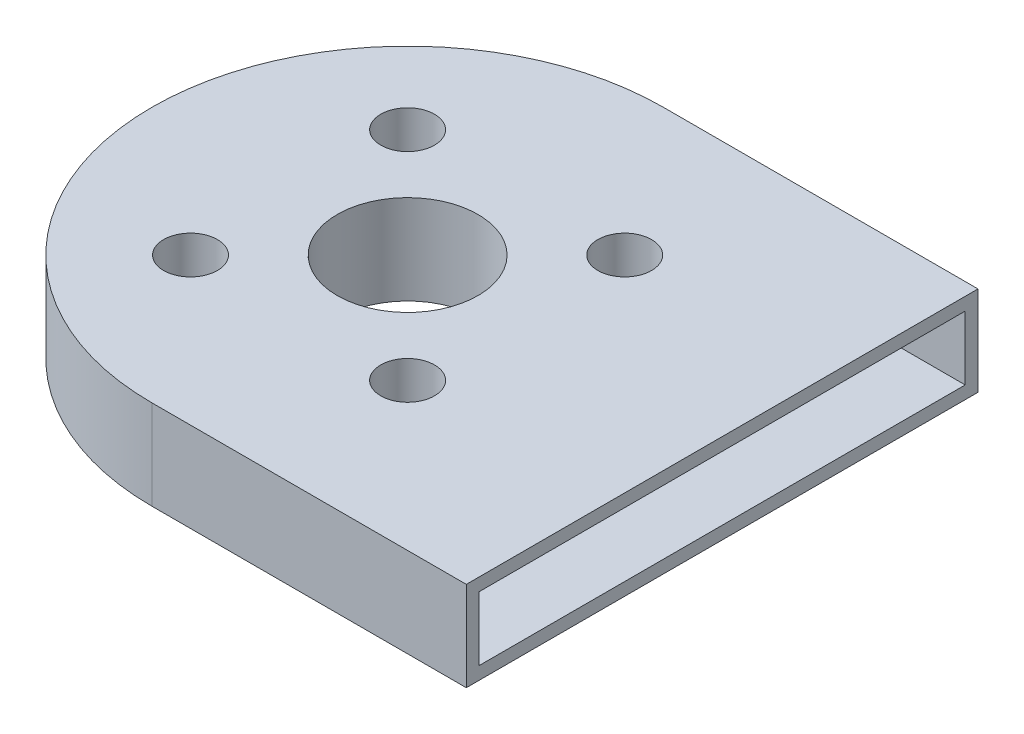
ISO-10303-21;
HEADER;
FILE_DESCRIPTION(('STEP AP214'),'2;1');
FILE_NAME('part.step','',(''),(''),'','','');
FILE_SCHEMA(('AUTOMOTIVE_DESIGN { 1 0 10303 214 1 1 1 1 }'));
ENDSEC;
DATA;
#1=APPLICATION_CONTEXT('core data for automotive mechanical design processes');
#2=APPLICATION_PROTOCOL_DEFINITION('international standard','automotive_design',2000,#1);
#3=PRODUCT_CONTEXT('',#1,'mechanical');
#4=PRODUCT('Part','Part','',(#3));
#5=PRODUCT_RELATED_PRODUCT_CATEGORY('part','',(#4));
#6=PRODUCT_DEFINITION_FORMATION('','',#4);
#7=PRODUCT_DEFINITION_CONTEXT('part definition',#1,'design');
#8=PRODUCT_DEFINITION('design','',#6,#7);
#9=PRODUCT_DEFINITION_SHAPE('','',#8);
#10=(LENGTH_UNIT() NAMED_UNIT(*) SI_UNIT(.MILLI.,.METRE.));
#11=(NAMED_UNIT(*) PLANE_ANGLE_UNIT() SI_UNIT($,.RADIAN.));
#12=(NAMED_UNIT(*) SI_UNIT($,.STERADIAN.) SOLID_ANGLE_UNIT());
#13=UNCERTAINTY_MEASURE_WITH_UNIT(LENGTH_MEASURE(1.E-05),#10,'distance_accuracy_value','');
#14=(GEOMETRIC_REPRESENTATION_CONTEXT(3) GLOBAL_UNCERTAINTY_ASSIGNED_CONTEXT((#13)) GLOBAL_UNIT_ASSIGNED_CONTEXT((#10,
#11,#12)) REPRESENTATION_CONTEXT('',''));
#15=CARTESIAN_POINT('',(0.,0.,0.));
#16=DIRECTION('',(0.,0.,1.));
#17=DIRECTION('',(1.,0.,0.));
#18=AXIS2_PLACEMENT_3D('',#15,#16,#17);
#19=CARTESIAN_POINT('',(12.29390465237,3.5,0.));
#20=DIRECTION('',(-1.,0.,0.));
#21=DIRECTION('',(0.,0.,1.));
#22=AXIS2_PLACEMENT_3D('',#19,#20,#21);
#23=PLANE('',#22);
#24=DIRECTION('',(0.,0.,-1.));
#25=VECTOR('',#24,1.);
#26=CARTESIAN_POINT('',(12.29390465237,0.,0.));
#27=LINE('',#26,#25);
#28=CARTESIAN_POINT('',(12.29390465237,0.,10.));
#29=VERTEX_POINT('',#28);
#30=CARTESIAN_POINT('',(12.29390465237,0.,-10.));
#31=VERTEX_POINT('',#30);
#32=EDGE_CURVE('E123',#29,#31,#27,.T.);
#33=ORIENTED_EDGE('',*,*,#32,.T.);
#34=DIRECTION('',(0.,-1.,0.));
#35=VECTOR('',#34,1.);
#36=CARTESIAN_POINT('',(12.29390465237,3.5,-10.));
#37=LINE('',#36,#35);
#38=CARTESIAN_POINT('',(12.29390465237,3.5,-10.));
#39=VERTEX_POINT('',#38);
#40=EDGE_CURVE('E185',#39,#31,#37,.T.);
#41=ORIENTED_EDGE('',*,*,#40,.F.);
#42=DIRECTION('',(0.,0.,-1.));
#43=VECTOR('',#42,1.);
#44=CARTESIAN_POINT('',(12.29390465237,3.5,0.));
#45=LINE('',#44,#43);
#46=CARTESIAN_POINT('',(12.29390465237,3.5,10.));
#47=VERTEX_POINT('',#46);
#48=EDGE_CURVE('E170',#47,#39,#45,.T.);
#49=ORIENTED_EDGE('',*,*,#48,.F.);
#50=DIRECTION('',(0.,-1.,0.));
#51=VECTOR('',#50,1.);
#52=CARTESIAN_POINT('',(12.29390465237,3.5,10.));
#53=LINE('',#52,#51);
#54=EDGE_CURVE('E178',#47,#29,#53,.T.);
#55=ORIENTED_EDGE('',*,*,#54,.T.);
#56=EDGE_LOOP('',(#33,#41,#49,#55));
#57=FACE_BOUND('',#56,.T.);
#58=DIRECTION('',(0.,0.,-1.));
#59=VECTOR('',#58,1.);
#60=CARTESIAN_POINT('',(12.29390465237,0.5,0.));
#61=LINE('',#60,#59);
#62=CARTESIAN_POINT('',(12.29390465237,0.5,9.5));
#63=VERTEX_POINT('',#62);
#64=CARTESIAN_POINT('',(12.29390465237,0.5,-9.5));
#65=VERTEX_POINT('',#64);
#66=EDGE_CURVE('E163',#63,#65,#61,.T.);
#67=ORIENTED_EDGE('',*,*,#66,.F.);
#68=DIRECTION('',(0.,-1.,0.));
#69=VECTOR('',#68,1.);
#70=CARTESIAN_POINT('',(12.29390465237,3.5,9.5));
#71=LINE('',#70,#69);
#72=CARTESIAN_POINT('',(12.29390465237,3.,9.5));
#73=VERTEX_POINT('',#72);
#74=EDGE_CURVE('E138',#73,#63,#71,.T.);
#75=ORIENTED_EDGE('',*,*,#74,.F.);
#76=DIRECTION('',(0.,0.,-1.));
#77=VECTOR('',#76,1.);
#78=CARTESIAN_POINT('',(12.29390465237,3.,0.));
#79=LINE('',#78,#77);
#80=CARTESIAN_POINT('',(12.29390465237,3.,-9.5));
#81=VERTEX_POINT('',#80);
#82=EDGE_CURVE('E66',#73,#81,#79,.T.);
#83=ORIENTED_EDGE('',*,*,#82,.T.);
#84=DIRECTION('',(0.,-1.,0.));
#85=VECTOR('',#84,1.);
#86=CARTESIAN_POINT('',(12.29390465237,3.5,-9.5));
#87=LINE('',#86,#85);
#88=EDGE_CURVE('E133',#81,#65,#87,.T.);
#89=ORIENTED_EDGE('',*,*,#88,.T.);
#90=EDGE_LOOP('',(#67,#75,#83,#89));
#91=FACE_BOUND('',#90,.T.);
#92=ADVANCED_FACE('F49',(#57,#91),#23,.F.);
#93=CARTESIAN_POINT('',(0.,3.5,0.));
#94=DIRECTION('',(0.,-1.,0.));
#95=DIRECTION('',(0.,0.,-1.));
#96=AXIS2_PLACEMENT_3D('',#93,#94,#95);
#97=CYLINDRICAL_SURFACE('',#96,2.75);
#98=CARTESIAN_POINT('',(0.,3.5,0.));
#99=DIRECTION('',(0.,1.,0.));
#100=DIRECTION('',(0.,0.,1.));
#101=AXIS2_PLACEMENT_3D('',#98,#99,#100);
#102=CIRCLE('',#101,2.75);
#103=CARTESIAN_POINT('',(0.,3.5,2.75));
#104=VERTEX_POINT('',#103);
#105=EDGE_CURVE('E58',#104,#104,#102,.T.);
#106=ORIENTED_EDGE('',*,*,#105,.T.);
#107=EDGE_LOOP('',(#106));
#108=FACE_BOUND('',#107,.T.);
#109=CARTESIAN_POINT('',(0.,0.,0.));
#110=DIRECTION('',(0.,1.,0.));
#111=DIRECTION('',(0.,0.,1.));
#112=AXIS2_PLACEMENT_3D('',#109,#110,#111);
#113=CIRCLE('',#112,2.75);
#114=CARTESIAN_POINT('',(0.,0.,2.75));
#115=VERTEX_POINT('',#114);
#116=EDGE_CURVE('E213',#115,#115,#113,.T.);
#117=ORIENTED_EDGE('',*,*,#116,.F.);
#118=EDGE_LOOP('',(#117));
#119=FACE_BOUND('',#118,.T.);
#120=ADVANCED_FACE('F246',(#108,#119),#97,.F.);
#121=CARTESIAN_POINT('',(-4.24264069,3.5,-4.24264069));
#122=DIRECTION('',(0.,-1.,0.));
#123=DIRECTION('',(0.,0.,-1.));
#124=AXIS2_PLACEMENT_3D('',#121,#122,#123);
#125=CYLINDRICAL_SURFACE('',#124,1.05);
#126=CARTESIAN_POINT('',(-4.24264069,3.5,-4.24264069));
#127=DIRECTION('',(0.,1.,0.));
#128=DIRECTION('',(0.,0.,1.));
#129=AXIS2_PLACEMENT_3D('',#126,#127,#128);
#130=CIRCLE('',#129,1.05);
#131=CARTESIAN_POINT('',(-4.24264069,3.5,-3.19264069));
#132=VERTEX_POINT('',#131);
#133=EDGE_CURVE('E204',#132,#132,#130,.T.);
#134=ORIENTED_EDGE('',*,*,#133,.T.);
#135=EDGE_LOOP('',(#134));
#136=FACE_BOUND('',#135,.T.);
#137=CARTESIAN_POINT('',(-4.24264069,0.,-4.24264069));
#138=DIRECTION('',(0.,1.,0.));
#139=DIRECTION('',(0.,0.,1.));
#140=AXIS2_PLACEMENT_3D('',#137,#138,#139);
#141=CIRCLE('',#140,1.05);
#142=CARTESIAN_POINT('',(-4.24264069,0.,-3.19264069));
#143=VERTEX_POINT('',#142);
#144=EDGE_CURVE('E210',#143,#143,#141,.T.);
#145=ORIENTED_EDGE('',*,*,#144,.F.);
#146=EDGE_LOOP('',(#145));
#147=FACE_BOUND('',#146,.T.);
#148=ADVANCED_FACE('F51',(#136,#147),#125,.F.);
#149=CARTESIAN_POINT('',(0.,3.5,0.));
#150=DIRECTION('',(0.,-1.,0.));
#151=DIRECTION('',(0.,0.,-1.));
#152=AXIS2_PLACEMENT_3D('',#149,#150,#151);
#153=CYLINDRICAL_SURFACE('',#152,10.);
#154=CARTESIAN_POINT('',(0.,3.5,0.));
#155=DIRECTION('',(0.,1.,0.));
#156=DIRECTION('',(0.,0.,1.));
#157=AXIS2_PLACEMENT_3D('',#154,#155,#156);
#158=CIRCLE('',#157,10.);
#159=CARTESIAN_POINT('',(0.,3.5,-10.));
#160=VERTEX_POINT('',#159);
#161=CARTESIAN_POINT('',(0.,3.5,10.));
#162=VERTEX_POINT('',#161);
#163=EDGE_CURVE('E11',#160,#162,#158,.T.);
#164=ORIENTED_EDGE('',*,*,#163,.F.);
#165=DIRECTION('',(0.,-1.,0.));
#166=VECTOR('',#165,1.);
#167=CARTESIAN_POINT('',(0.,3.5,-10.));
#168=LINE('',#167,#166);
#169=CARTESIAN_POINT('',(0.,0.,-10.));
#170=VERTEX_POINT('',#169);
#171=EDGE_CURVE('E188',#160,#170,#168,.T.);
#172=ORIENTED_EDGE('',*,*,#171,.T.);
#173=CARTESIAN_POINT('',(0.,0.,0.));
#174=DIRECTION('',(0.,1.,0.));
#175=DIRECTION('',(0.,0.,1.));
#176=AXIS2_PLACEMENT_3D('',#173,#174,#175);
#177=CIRCLE('',#176,10.);
#178=CARTESIAN_POINT('',(0.,0.,10.));
#179=VERTEX_POINT('',#178);
#180=EDGE_CURVE('E207',#170,#179,#177,.T.);
#181=ORIENTED_EDGE('',*,*,#180,.T.);
#182=DIRECTION('',(0.,-1.,0.));
#183=VECTOR('',#182,1.);
#184=CARTESIAN_POINT('',(0.,3.5,10.));
#185=LINE('',#184,#183);
#186=EDGE_CURVE('E190',#162,#179,#185,.T.);
#187=ORIENTED_EDGE('',*,*,#186,.F.);
#188=EDGE_LOOP('',(#164,#172,#181,#187));
#189=FACE_BOUND('',#188,.T.);
#190=ADVANCED_FACE('F443',(#189),#153,.T.);
#191=CARTESIAN_POINT('',(0.,3.5,0.));
#192=DIRECTION('',(0.,1.,0.));
#193=DIRECTION('',(0.,0.,1.));
#194=AXIS2_PLACEMENT_3D('',#191,#192,#193);
#195=PLANE('',#194);
#196=CARTESIAN_POINT('',(-4.24264069,3.5,4.24264069));
#197=DIRECTION('',(0.,1.,0.));
#198=DIRECTION('',(0.,0.,1.));
#199=AXIS2_PLACEMENT_3D('',#196,#197,#198);
#200=CIRCLE('',#199,1.05);
#201=CARTESIAN_POINT('',(-4.24264069,3.5,5.29264069));
#202=VERTEX_POINT('',#201);
#203=EDGE_CURVE('E195',#202,#202,#200,.T.);
#204=ORIENTED_EDGE('',*,*,#203,.F.);
#205=EDGE_LOOP('',(#204));
#206=FACE_BOUND('',#205,.T.);
#207=CARTESIAN_POINT('',(4.24264069,3.5,-4.24264069));
#208=DIRECTION('',(0.,1.,0.));
#209=DIRECTION('',(0.,0.,1.));
#210=AXIS2_PLACEMENT_3D('',#207,#208,#209);
#211=CIRCLE('',#210,1.05);
#212=CARTESIAN_POINT('',(4.24264069,3.5,-3.19264069));
#213=VERTEX_POINT('',#212);
#214=EDGE_CURVE('E199',#213,#213,#211,.T.);
#215=ORIENTED_EDGE('',*,*,#214,.F.);
#216=EDGE_LOOP('',(#215));
#217=FACE_BOUND('',#216,.T.);
#218=CARTESIAN_POINT('',(4.24264069,3.5,4.24264069));
#219=DIRECTION('',(0.,1.,0.));
#220=DIRECTION('',(0.,0.,1.));
#221=AXIS2_PLACEMENT_3D('',#218,#219,#220);
#222=CIRCLE('',#221,1.05);
#223=CARTESIAN_POINT('',(4.24264069,3.5,5.29264069));
#224=VERTEX_POINT('',#223);
#225=EDGE_CURVE('E187',#224,#224,#222,.T.);
#226=ORIENTED_EDGE('',*,*,#225,.F.);
#227=EDGE_LOOP('',(#226));
#228=FACE_BOUND('',#227,.T.);
#229=ORIENTED_EDGE('',*,*,#133,.F.);
#230=EDGE_LOOP('',(#229));
#231=FACE_BOUND('',#230,.T.);
#232=ORIENTED_EDGE('',*,*,#105,.F.);
#233=EDGE_LOOP('',(#232));
#234=FACE_BOUND('',#233,.T.);
#235=ORIENTED_EDGE('',*,*,#163,.T.);
#236=DIRECTION('',(1.,0.,0.));
#237=VECTOR('',#236,1.);
#238=CARTESIAN_POINT('',(0.,3.5,10.));
#239=LINE('',#238,#237);
#240=EDGE_CURVE('E172',#162,#47,#239,.T.);
#241=ORIENTED_EDGE('',*,*,#240,.T.);
#242=ORIENTED_EDGE('',*,*,#48,.T.);
#243=DIRECTION('',(1.,0.,0.));
#244=VECTOR('',#243,1.);
#245=CARTESIAN_POINT('',(0.,3.5,-10.));
#246=LINE('',#245,#244);
#247=EDGE_CURVE('E175',#160,#39,#246,.T.);
#248=ORIENTED_EDGE('',*,*,#247,.F.);
#249=EDGE_LOOP('',(#235,#241,#242,#248));
#250=FACE_BOUND('',#249,.T.);
#251=ADVANCED_FACE('F435',(#206,#217,#228,#231,#234,#250),#195,.T.);
#252=CARTESIAN_POINT('',(0.,0.,0.));
#253=DIRECTION('',(0.,1.,0.));
#254=DIRECTION('',(0.,0.,1.));
#255=AXIS2_PLACEMENT_3D('',#252,#253,#254);
#256=PLANE('',#255);
#257=CARTESIAN_POINT('',(-4.24264069,0.,4.24264069));
#258=DIRECTION('',(0.,1.,0.));
#259=DIRECTION('',(0.,0.,1.));
#260=AXIS2_PLACEMENT_3D('',#257,#258,#259);
#261=CIRCLE('',#260,1.05);
#262=CARTESIAN_POINT('',(-4.24264069,0.,5.29264069));
#263=VERTEX_POINT('',#262);
#264=EDGE_CURVE('E53',#263,#263,#261,.T.);
#265=ORIENTED_EDGE('',*,*,#264,.T.);
#266=EDGE_LOOP('',(#265));
#267=FACE_BOUND('',#266,.T.);
#268=CARTESIAN_POINT('',(4.24264069,0.,-4.24264069));
#269=DIRECTION('',(0.,1.,0.));
#270=DIRECTION('',(0.,0.,1.));
#271=AXIS2_PLACEMENT_3D('',#268,#269,#270);
#272=CIRCLE('',#271,1.05);
#273=CARTESIAN_POINT('',(4.24264069,0.,-3.19264069));
#274=VERTEX_POINT('',#273);
#275=EDGE_CURVE('E218',#274,#274,#272,.T.);
#276=ORIENTED_EDGE('',*,*,#275,.T.);
#277=EDGE_LOOP('',(#276));
#278=FACE_BOUND('',#277,.T.);
#279=CARTESIAN_POINT('',(4.24264069,0.,4.24264069));
#280=DIRECTION('',(0.,1.,0.));
#281=DIRECTION('',(0.,0.,1.));
#282=AXIS2_PLACEMENT_3D('',#279,#280,#281);
#283=CIRCLE('',#282,1.05);
#284=CARTESIAN_POINT('',(4.24264069,0.,5.29264069));
#285=VERTEX_POINT('',#284);
#286=EDGE_CURVE('E198',#285,#285,#283,.T.);
#287=ORIENTED_EDGE('',*,*,#286,.T.);
#288=EDGE_LOOP('',(#287));
#289=FACE_BOUND('',#288,.T.);
#290=ORIENTED_EDGE('',*,*,#144,.T.);
#291=EDGE_LOOP('',(#290));
#292=FACE_BOUND('',#291,.T.);
#293=ORIENTED_EDGE('',*,*,#116,.T.);
#294=EDGE_LOOP('',(#293));
#295=FACE_BOUND('',#294,.T.);
#296=ORIENTED_EDGE('',*,*,#180,.F.);
#297=DIRECTION('',(1.,0.,0.));
#298=VECTOR('',#297,1.);
#299=CARTESIAN_POINT('',(0.,0.,-10.));
#300=LINE('',#299,#298);
#301=EDGE_CURVE('E173',#170,#31,#300,.T.);
#302=ORIENTED_EDGE('',*,*,#301,.T.);
#303=ORIENTED_EDGE('',*,*,#32,.F.);
#304=DIRECTION('',(1.,0.,0.));
#305=VECTOR('',#304,1.);
#306=CARTESIAN_POINT('',(0.,0.,10.));
#307=LINE('',#306,#305);
#308=EDGE_CURVE('E181',#179,#29,#307,.T.);
#309=ORIENTED_EDGE('',*,*,#308,.F.);
#310=EDGE_LOOP('',(#296,#302,#303,#309));
#311=FACE_BOUND('',#310,.T.);
#312=ADVANCED_FACE('F225',(#267,#278,#289,#292,#295,#311),#256,.F.);
#313=CARTESIAN_POINT('',(4.24264069,-6.5,4.24264069));
#314=DIRECTION('',(0.,1.,0.));
#315=DIRECTION('',(0.,0.,1.));
#316=AXIS2_PLACEMENT_3D('',#313,#314,#315);
#317=CYLINDRICAL_SURFACE('',#316,1.05);
#318=ORIENTED_EDGE('',*,*,#225,.T.);
#319=EDGE_LOOP('',(#318));
#320=FACE_BOUND('',#319,.T.);
#321=ORIENTED_EDGE('',*,*,#286,.F.);
#322=EDGE_LOOP('',(#321));
#323=FACE_BOUND('',#322,.T.);
#324=ADVANCED_FACE('F241',(#320,#323),#317,.F.);
#325=CARTESIAN_POINT('',(4.24264069,-6.5,-4.24264069));
#326=DIRECTION('',(0.,1.,0.));
#327=DIRECTION('',(0.,0.,1.));
#328=AXIS2_PLACEMENT_3D('',#325,#326,#327);
#329=CYLINDRICAL_SURFACE('',#328,1.05);
#330=ORIENTED_EDGE('',*,*,#214,.T.);
#331=EDGE_LOOP('',(#330));
#332=FACE_BOUND('',#331,.T.);
#333=ORIENTED_EDGE('',*,*,#275,.F.);
#334=EDGE_LOOP('',(#333));
#335=FACE_BOUND('',#334,.T.);
#336=ADVANCED_FACE('F230',(#332,#335),#329,.F.);
#337=CARTESIAN_POINT('',(-4.24264069,-6.5,4.24264069));
#338=DIRECTION('',(0.,1.,0.));
#339=DIRECTION('',(0.,0.,1.));
#340=AXIS2_PLACEMENT_3D('',#337,#338,#339);
#341=CYLINDRICAL_SURFACE('',#340,1.05);
#342=ORIENTED_EDGE('',*,*,#203,.T.);
#343=EDGE_LOOP('',(#342));
#344=FACE_BOUND('',#343,.T.);
#345=ORIENTED_EDGE('',*,*,#264,.F.);
#346=EDGE_LOOP('',(#345));
#347=FACE_BOUND('',#346,.T.);
#348=ADVANCED_FACE('F227',(#344,#347),#341,.F.);
#349=CARTESIAN_POINT('',(0.,3.5,-10.));
#350=DIRECTION('',(0.,0.,-1.));
#351=DIRECTION('',(-1.,0.,0.));
#352=AXIS2_PLACEMENT_3D('',#349,#350,#351);
#353=PLANE('',#352);
#354=ORIENTED_EDGE('',*,*,#301,.F.);
#355=ORIENTED_EDGE('',*,*,#171,.F.);
#356=ORIENTED_EDGE('',*,*,#247,.T.);
#357=ORIENTED_EDGE('',*,*,#40,.T.);
#358=EDGE_LOOP('',(#354,#355,#356,#357));
#359=FACE_BOUND('',#358,.T.);
#360=ADVANCED_FACE('F229',(#359),#353,.T.);
#361=CARTESIAN_POINT('',(0.,3.5,10.));
#362=DIRECTION('',(0.,0.,-1.));
#363=DIRECTION('',(-1.,0.,0.));
#364=AXIS2_PLACEMENT_3D('',#361,#362,#363);
#365=PLANE('',#364);
#366=ORIENTED_EDGE('',*,*,#308,.T.);
#367=ORIENTED_EDGE('',*,*,#54,.F.);
#368=ORIENTED_EDGE('',*,*,#240,.F.);
#369=ORIENTED_EDGE('',*,*,#186,.T.);
#370=EDGE_LOOP('',(#366,#367,#368,#369));
#371=FACE_BOUND('',#370,.T.);
#372=ADVANCED_FACE('F238',(#371),#365,.F.);
#373=CARTESIAN_POINT('',(0.,3.5,0.));
#374=DIRECTION('',(0.,-1.,0.));
#375=DIRECTION('',(0.,0.,-1.));
#376=AXIS2_PLACEMENT_3D('',#373,#374,#375);
#377=CYLINDRICAL_SURFACE('',#376,3.25);
#378=CARTESIAN_POINT('',(0.,3.,0.));
#379=DIRECTION('',(0.,1.,0.));
#380=DIRECTION('',(0.,0.,1.));
#381=AXIS2_PLACEMENT_3D('',#378,#379,#380);
#382=CIRCLE('',#381,3.25);
#383=CARTESIAN_POINT('',(0.,3.,3.25));
#384=VERTEX_POINT('',#383);
#385=EDGE_CURVE('E124',#384,#384,#382,.T.);
#386=ORIENTED_EDGE('',*,*,#385,.F.);
#387=EDGE_LOOP('',(#386));
#388=FACE_BOUND('',#387,.T.);
#389=CARTESIAN_POINT('',(0.,0.5,0.));
#390=DIRECTION('',(0.,1.,0.));
#391=DIRECTION('',(0.,0.,1.));
#392=AXIS2_PLACEMENT_3D('',#389,#390,#391);
#393=CIRCLE('',#392,3.25);
#394=CARTESIAN_POINT('',(0.,0.5,3.25));
#395=VERTEX_POINT('',#394);
#396=EDGE_CURVE('E147',#395,#395,#393,.T.);
#397=ORIENTED_EDGE('',*,*,#396,.T.);
#398=EDGE_LOOP('',(#397));
#399=FACE_BOUND('',#398,.T.);
#400=ADVANCED_FACE('F256',(#388,#399),#377,.T.);
#401=CARTESIAN_POINT('',(-4.24264069,3.5,-4.24264069));
#402=DIRECTION('',(0.,-1.,0.));
#403=DIRECTION('',(0.,0.,-1.));
#404=AXIS2_PLACEMENT_3D('',#401,#402,#403);
#405=CYLINDRICAL_SURFACE('',#404,1.55);
#406=CARTESIAN_POINT('',(-4.24264069,3.,-4.24264069));
#407=DIRECTION('',(0.,1.,0.));
#408=DIRECTION('',(0.,0.,1.));
#409=AXIS2_PLACEMENT_3D('',#406,#407,#408);
#410=CIRCLE('',#409,1.55);
#411=CARTESIAN_POINT('',(-4.24264069,3.,-2.69264069));
#412=VERTEX_POINT('',#411);
#413=EDGE_CURVE('E159',#412,#412,#410,.T.);
#414=ORIENTED_EDGE('',*,*,#413,.F.);
#415=EDGE_LOOP('',(#414));
#416=FACE_BOUND('',#415,.T.);
#417=CARTESIAN_POINT('',(-4.24264069,0.5,-4.24264069));
#418=DIRECTION('',(0.,1.,0.));
#419=DIRECTION('',(0.,0.,1.));
#420=AXIS2_PLACEMENT_3D('',#417,#418,#419);
#421=CIRCLE('',#420,1.55);
#422=CARTESIAN_POINT('',(-4.24264069,0.5,-2.69264069));
#423=VERTEX_POINT('',#422);
#424=EDGE_CURVE('E144',#423,#423,#421,.T.);
#425=ORIENTED_EDGE('',*,*,#424,.T.);
#426=EDGE_LOOP('',(#425));
#427=FACE_BOUND('',#426,.T.);
#428=ADVANCED_FACE('F286',(#416,#427),#405,.T.);
#429=CARTESIAN_POINT('',(0.,3.5,0.));
#430=DIRECTION('',(0.,-1.,0.));
#431=DIRECTION('',(0.,0.,-1.));
#432=AXIS2_PLACEMENT_3D('',#429,#430,#431);
#433=CYLINDRICAL_SURFACE('',#432,9.5);
#434=CARTESIAN_POINT('',(0.,3.,0.));
#435=DIRECTION('',(0.,1.,0.));
#436=DIRECTION('',(0.,0.,1.));
#437=AXIS2_PLACEMENT_3D('',#434,#435,#436);
#438=CIRCLE('',#437,9.5);
#439=CARTESIAN_POINT('',(0.,3.,-9.5));
#440=VERTEX_POINT('',#439);
#441=CARTESIAN_POINT('',(0.,3.,9.5));
#442=VERTEX_POINT('',#441);
#443=EDGE_CURVE('E115',#440,#442,#438,.T.);
#444=ORIENTED_EDGE('',*,*,#443,.T.);
#445=DIRECTION('',(0.,1.,0.));
#446=VECTOR('',#445,1.);
#447=CARTESIAN_POINT('',(0.,3.5,9.5));
#448=LINE('',#447,#446);
#449=CARTESIAN_POINT('',(0.,0.5,9.5));
#450=VERTEX_POINT('',#449);
#451=EDGE_CURVE('E134',#442,#450,#448,.F.);
#452=ORIENTED_EDGE('',*,*,#451,.T.);
#453=CARTESIAN_POINT('',(0.,0.5,0.));
#454=DIRECTION('',(0.,1.,0.));
#455=DIRECTION('',(0.,0.,1.));
#456=AXIS2_PLACEMENT_3D('',#453,#454,#455);
#457=CIRCLE('',#456,9.5);
#458=CARTESIAN_POINT('',(0.,0.5,-9.5));
#459=VERTEX_POINT('',#458);
#460=EDGE_CURVE('E129',#459,#450,#457,.T.);
#461=ORIENTED_EDGE('',*,*,#460,.F.);
#462=DIRECTION('',(0.,-1.,0.));
#463=VECTOR('',#462,1.);
#464=CARTESIAN_POINT('',(0.,3.5,-9.5));
#465=LINE('',#464,#463);
#466=EDGE_CURVE('E127',#440,#459,#465,.T.);
#467=ORIENTED_EDGE('',*,*,#466,.F.);
#468=EDGE_LOOP('',(#444,#452,#461,#467));
#469=FACE_BOUND('',#468,.T.);
#470=ADVANCED_FACE('F128',(#469),#433,.F.);
#471=CARTESIAN_POINT('',(0.,3.,0.));
#472=DIRECTION('',(0.,1.,0.));
#473=DIRECTION('',(0.,0.,1.));
#474=AXIS2_PLACEMENT_3D('',#471,#472,#473);
#475=PLANE('',#474);
#476=CARTESIAN_POINT('',(-4.24264069,3.,4.24264069));
#477=DIRECTION('',(0.,1.,0.));
#478=DIRECTION('',(0.,0.,1.));
#479=AXIS2_PLACEMENT_3D('',#476,#477,#478);
#480=CIRCLE('',#479,1.55);
#481=CARTESIAN_POINT('',(-4.24264069,3.,5.79264069));
#482=VERTEX_POINT('',#481);
#483=EDGE_CURVE('E157',#482,#482,#480,.T.);
#484=ORIENTED_EDGE('',*,*,#483,.T.);
#485=EDGE_LOOP('',(#484));
#486=FACE_BOUND('',#485,.T.);
#487=CARTESIAN_POINT('',(4.24264069,3.,-4.24264069));
#488=DIRECTION('',(0.,1.,0.));
#489=DIRECTION('',(0.,0.,1.));
#490=AXIS2_PLACEMENT_3D('',#487,#488,#489);
#491=CIRCLE('',#490,1.55);
#492=CARTESIAN_POINT('',(4.24264069,3.,-2.69264069));
#493=VERTEX_POINT('',#492);
#494=EDGE_CURVE('E304',#493,#493,#491,.T.);
#495=ORIENTED_EDGE('',*,*,#494,.T.);
#496=EDGE_LOOP('',(#495));
#497=FACE_BOUND('',#496,.T.);
#498=CARTESIAN_POINT('',(4.24264069,3.,4.24264069));
#499=DIRECTION('',(0.,1.,0.));
#500=DIRECTION('',(0.,0.,1.));
#501=AXIS2_PLACEMENT_3D('',#498,#499,#500);
#502=CIRCLE('',#501,1.55);
#503=CARTESIAN_POINT('',(4.24264069,3.,5.79264069));
#504=VERTEX_POINT('',#503);
#505=EDGE_CURVE('E169',#504,#504,#502,.T.);
#506=ORIENTED_EDGE('',*,*,#505,.T.);
#507=EDGE_LOOP('',(#506));
#508=FACE_BOUND('',#507,.T.);
#509=ORIENTED_EDGE('',*,*,#413,.T.);
#510=EDGE_LOOP('',(#509));
#511=FACE_BOUND('',#510,.T.);
#512=ORIENTED_EDGE('',*,*,#385,.T.);
#513=EDGE_LOOP('',(#512));
#514=FACE_BOUND('',#513,.T.);
#515=ORIENTED_EDGE('',*,*,#443,.F.);
#516=DIRECTION('',(1.,0.,0.));
#517=VECTOR('',#516,1.);
#518=CARTESIAN_POINT('',(0.,3.,-9.5));
#519=LINE('',#518,#517);
#520=EDGE_CURVE('E119',#440,#81,#519,.T.);
#521=ORIENTED_EDGE('',*,*,#520,.T.);
#522=ORIENTED_EDGE('',*,*,#82,.F.);
#523=DIRECTION('',(1.,0.,0.));
#524=VECTOR('',#523,1.);
#525=CARTESIAN_POINT('',(0.,3.,9.5));
#526=LINE('',#525,#524);
#527=EDGE_CURVE('E120',#442,#73,#526,.T.);
#528=ORIENTED_EDGE('',*,*,#527,.F.);
#529=EDGE_LOOP('',(#515,#521,#522,#528));
#530=FACE_BOUND('',#529,.T.);
#531=ADVANCED_FACE('F117',(#486,#497,#508,#511,#514,#530),#475,.F.);
#532=CARTESIAN_POINT('',(0.,0.5,0.));
#533=DIRECTION('',(0.,1.,0.));
#534=DIRECTION('',(0.,0.,1.));
#535=AXIS2_PLACEMENT_3D('',#532,#533,#534);
#536=PLANE('',#535);
#537=CARTESIAN_POINT('',(-4.24264069,0.5,4.24264069));
#538=DIRECTION('',(0.,1.,0.));
#539=DIRECTION('',(0.,0.,1.));
#540=AXIS2_PLACEMENT_3D('',#537,#538,#539);
#541=CIRCLE('',#540,1.55);
#542=CARTESIAN_POINT('',(-4.24264069,0.5,5.79264069));
#543=VERTEX_POINT('',#542);
#544=EDGE_CURVE('E148',#543,#543,#541,.T.);
#545=ORIENTED_EDGE('',*,*,#544,.F.);
#546=EDGE_LOOP('',(#545));
#547=FACE_BOUND('',#546,.T.);
#548=CARTESIAN_POINT('',(4.24264069,0.5,-4.24264069));
#549=DIRECTION('',(0.,1.,0.));
#550=DIRECTION('',(0.,0.,1.));
#551=AXIS2_PLACEMENT_3D('',#548,#549,#550);
#552=CIRCLE('',#551,1.55);
#553=CARTESIAN_POINT('',(4.24264069,0.5,-2.69264069));
#554=VERTEX_POINT('',#553);
#555=EDGE_CURVE('E151',#554,#554,#552,.T.);
#556=ORIENTED_EDGE('',*,*,#555,.F.);
#557=EDGE_LOOP('',(#556));
#558=FACE_BOUND('',#557,.T.);
#559=CARTESIAN_POINT('',(4.24264069,0.5,4.24264069));
#560=DIRECTION('',(0.,1.,0.));
#561=DIRECTION('',(0.,0.,1.));
#562=AXIS2_PLACEMENT_3D('',#559,#560,#561);
#563=CIRCLE('',#562,1.55);
#564=CARTESIAN_POINT('',(4.24264069,0.5,5.79264069));
#565=VERTEX_POINT('',#564);
#566=EDGE_CURVE('E154',#565,#565,#563,.T.);
#567=ORIENTED_EDGE('',*,*,#566,.F.);
#568=EDGE_LOOP('',(#567));
#569=FACE_BOUND('',#568,.T.);
#570=ORIENTED_EDGE('',*,*,#424,.F.);
#571=EDGE_LOOP('',(#570));
#572=FACE_BOUND('',#571,.T.);
#573=ORIENTED_EDGE('',*,*,#396,.F.);
#574=EDGE_LOOP('',(#573));
#575=FACE_BOUND('',#574,.T.);
#576=ORIENTED_EDGE('',*,*,#460,.T.);
#577=DIRECTION('',(1.,0.,0.));
#578=VECTOR('',#577,1.);
#579=CARTESIAN_POINT('',(0.,0.5,9.5));
#580=LINE('',#579,#578);
#581=EDGE_CURVE('E162',#450,#63,#580,.T.);
#582=ORIENTED_EDGE('',*,*,#581,.T.);
#583=ORIENTED_EDGE('',*,*,#66,.T.);
#584=DIRECTION('',(1.,0.,0.));
#585=VECTOR('',#584,1.);
#586=CARTESIAN_POINT('',(0.,0.5,-9.5));
#587=LINE('',#586,#585);
#588=EDGE_CURVE('E160',#459,#65,#587,.T.);
#589=ORIENTED_EDGE('',*,*,#588,.F.);
#590=EDGE_LOOP('',(#576,#582,#583,#589));
#591=FACE_BOUND('',#590,.T.);
#592=ADVANCED_FACE('F276',(#547,#558,#569,#572,#575,#591),#536,.T.);
#593=CARTESIAN_POINT('',(4.24264069,-6.5,4.24264069));
#594=DIRECTION('',(0.,1.,0.));
#595=DIRECTION('',(0.,0.,1.));
#596=AXIS2_PLACEMENT_3D('',#593,#594,#595);
#597=CYLINDRICAL_SURFACE('',#596,1.55);
#598=ORIENTED_EDGE('',*,*,#505,.F.);
#599=EDGE_LOOP('',(#598));
#600=FACE_BOUND('',#599,.T.);
#601=ORIENTED_EDGE('',*,*,#566,.T.);
#602=EDGE_LOOP('',(#601));
#603=FACE_BOUND('',#602,.T.);
#604=ADVANCED_FACE('F272',(#600,#603),#597,.T.);
#605=CARTESIAN_POINT('',(4.24264069,-6.5,-4.24264069));
#606=DIRECTION('',(0.,1.,0.));
#607=DIRECTION('',(0.,0.,1.));
#608=AXIS2_PLACEMENT_3D('',#605,#606,#607);
#609=CYLINDRICAL_SURFACE('',#608,1.55);
#610=ORIENTED_EDGE('',*,*,#494,.F.);
#611=EDGE_LOOP('',(#610));
#612=FACE_BOUND('',#611,.T.);
#613=ORIENTED_EDGE('',*,*,#555,.T.);
#614=EDGE_LOOP('',(#613));
#615=FACE_BOUND('',#614,.T.);
#616=ADVANCED_FACE('F268',(#612,#615),#609,.T.);
#617=CARTESIAN_POINT('',(-4.24264069,-6.5,4.24264069));
#618=DIRECTION('',(0.,1.,0.));
#619=DIRECTION('',(0.,0.,1.));
#620=AXIS2_PLACEMENT_3D('',#617,#618,#619);
#621=CYLINDRICAL_SURFACE('',#620,1.55);
#622=ORIENTED_EDGE('',*,*,#483,.F.);
#623=EDGE_LOOP('',(#622));
#624=FACE_BOUND('',#623,.T.);
#625=ORIENTED_EDGE('',*,*,#544,.T.);
#626=EDGE_LOOP('',(#625));
#627=FACE_BOUND('',#626,.T.);
#628=ADVANCED_FACE('F265',(#624,#627),#621,.T.);
#629=CARTESIAN_POINT('',(0.,3.5,-9.5));
#630=DIRECTION('',(0.,0.,-1.));
#631=DIRECTION('',(-1.,0.,0.));
#632=AXIS2_PLACEMENT_3D('',#629,#630,#631);
#633=PLANE('',#632);
#634=ORIENTED_EDGE('',*,*,#588,.T.);
#635=ORIENTED_EDGE('',*,*,#88,.F.);
#636=ORIENTED_EDGE('',*,*,#520,.F.);
#637=ORIENTED_EDGE('',*,*,#466,.T.);
#638=EDGE_LOOP('',(#634,#635,#636,#637));
#639=FACE_BOUND('',#638,.T.);
#640=ADVANCED_FACE('F136',(#639),#633,.F.);
#641=CARTESIAN_POINT('',(0.,3.5,9.5));
#642=DIRECTION('',(0.,0.,-1.));
#643=DIRECTION('',(-1.,0.,0.));
#644=AXIS2_PLACEMENT_3D('',#641,#642,#643);
#645=PLANE('',#644);
#646=ORIENTED_EDGE('',*,*,#581,.F.);
#647=ORIENTED_EDGE('',*,*,#451,.F.);
#648=ORIENTED_EDGE('',*,*,#527,.T.);
#649=ORIENTED_EDGE('',*,*,#74,.T.);
#650=EDGE_LOOP('',(#646,#647,#648,#649));
#651=FACE_BOUND('',#650,.T.);
#652=ADVANCED_FACE('F259',(#651),#645,.T.);
#653=CLOSED_SHELL('',(#92,#120,#148,#190,#251,#312,#324,#336,#348,#360,#372,#400,#428,#470,#531,
#592,#604,#616,#628,#640,#652));
#654=MANIFOLD_SOLID_BREP('B2',#653);
#655=ADVANCED_BREP_SHAPE_REPRESENTATION('',(#18,#654),#14);
#656=SHAPE_DEFINITION_REPRESENTATION(#9,#655);
ENDSEC;
END-ISO-10303-21;
